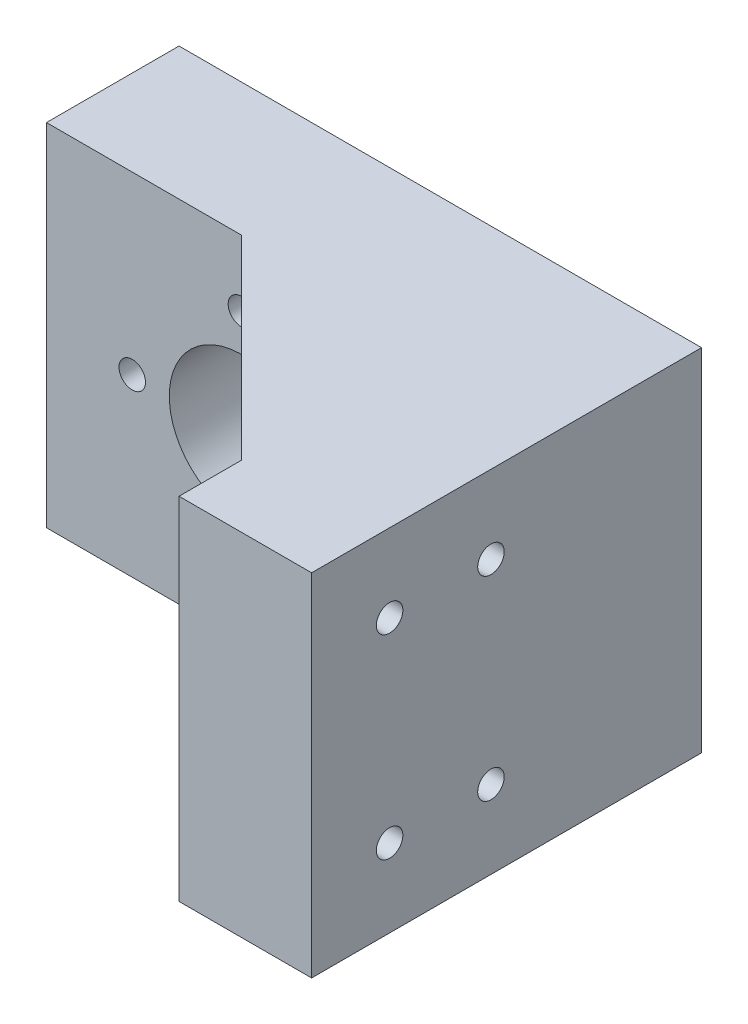
ISO-10303-21;
HEADER;
FILE_DESCRIPTION(('STEP AP214'),'2;1');
FILE_NAME('part.step','',(''),(''),'','','');
FILE_SCHEMA(('AUTOMOTIVE_DESIGN { 1 0 10303 214 1 1 1 1 }'));
ENDSEC;
DATA;
#1=APPLICATION_CONTEXT('core data for automotive mechanical design processes');
#2=APPLICATION_PROTOCOL_DEFINITION('international standard','automotive_design',2000,#1);
#3=PRODUCT_CONTEXT('',#1,'mechanical');
#4=PRODUCT('Part','Part','',(#3));
#5=PRODUCT_RELATED_PRODUCT_CATEGORY('part','',(#4));
#6=PRODUCT_DEFINITION_FORMATION('','',#4);
#7=PRODUCT_DEFINITION_CONTEXT('part definition',#1,'design');
#8=PRODUCT_DEFINITION('design','',#6,#7);
#9=PRODUCT_DEFINITION_SHAPE('','',#8);
#10=(LENGTH_UNIT() NAMED_UNIT(*) SI_UNIT(.MILLI.,.METRE.));
#11=(NAMED_UNIT(*) PLANE_ANGLE_UNIT() SI_UNIT($,.RADIAN.));
#12=(NAMED_UNIT(*) SI_UNIT($,.STERADIAN.) SOLID_ANGLE_UNIT());
#13=UNCERTAINTY_MEASURE_WITH_UNIT(LENGTH_MEASURE(1.E-05),#10,'distance_accuracy_value','');
#14=(GEOMETRIC_REPRESENTATION_CONTEXT(3) GLOBAL_UNCERTAINTY_ASSIGNED_CONTEXT((#13)) GLOBAL_UNIT_ASSIGNED_CONTEXT((#10,
#11,#12)) REPRESENTATION_CONTEXT('',''));
#15=CARTESIAN_POINT('',(0.,0.,0.));
#16=DIRECTION('',(0.,0.,1.));
#17=DIRECTION('',(1.,0.,0.));
#18=AXIS2_PLACEMENT_3D('',#15,#16,#17);
#19=CARTESIAN_POINT('',(16.5,-22.5,50.));
#20=DIRECTION('',(-1.,0.,0.));
#21=DIRECTION('',(0.,0.,1.));
#22=AXIS2_PLACEMENT_3D('',#19,#20,#21);
#23=PLANE('',#22);
#24=CARTESIAN_POINT('',(16.5,12.5,40.));
#25=DIRECTION('',(-1.,0.,0.));
#26=DIRECTION('',(0.,0.,1.));
#27=AXIS2_PLACEMENT_3D('',#24,#25,#26);
#28=CIRCLE('',#27,1.7);
#29=CARTESIAN_POINT('',(16.5,12.5,41.7));
#30=VERTEX_POINT('',#29);
#31=EDGE_CURVE('E162',#30,#30,#28,.T.);
#32=ORIENTED_EDGE('',*,*,#31,.F.);
#33=EDGE_LOOP('',(#32));
#34=FACE_BOUND('',#33,.T.);
#35=CARTESIAN_POINT('',(16.5,-12.5,27.));
#36=DIRECTION('',(-1.,0.,0.));
#37=DIRECTION('',(0.,0.,-1.));
#38=AXIS2_PLACEMENT_3D('',#35,#36,#37);
#39=CIRCLE('',#38,1.7);
#40=CARTESIAN_POINT('',(16.5,-12.5,25.3));
#41=VERTEX_POINT('',#40);
#42=EDGE_CURVE('E169',#41,#41,#39,.T.);
#43=ORIENTED_EDGE('',*,*,#42,.F.);
#44=EDGE_LOOP('',(#43));
#45=FACE_BOUND('',#44,.T.);
#46=CARTESIAN_POINT('',(16.5,12.5,27.));
#47=DIRECTION('',(-1.,0.,0.));
#48=DIRECTION('',(0.,0.,-1.));
#49=AXIS2_PLACEMENT_3D('',#46,#47,#48);
#50=CIRCLE('',#49,1.7);
#51=CARTESIAN_POINT('',(16.5,12.5,25.3));
#52=VERTEX_POINT('',#51);
#53=EDGE_CURVE('E159',#52,#52,#50,.T.);
#54=ORIENTED_EDGE('',*,*,#53,.F.);
#55=EDGE_LOOP('',(#54));
#56=FACE_BOUND('',#55,.T.);
#57=CARTESIAN_POINT('',(16.5,-12.5,40.));
#58=DIRECTION('',(-1.,0.,0.));
#59=DIRECTION('',(0.,0.,1.));
#60=AXIS2_PLACEMENT_3D('',#57,#58,#59);
#61=CIRCLE('',#60,1.7);
#62=CARTESIAN_POINT('',(16.5,-12.5,41.7));
#63=VERTEX_POINT('',#62);
#64=EDGE_CURVE('E164',#63,#63,#61,.T.);
#65=ORIENTED_EDGE('',*,*,#64,.F.);
#66=EDGE_LOOP('',(#65));
#67=FACE_BOUND('',#66,.T.);
#68=DIRECTION('',(0.,1.,0.));
#69=VECTOR('',#68,1.);
#70=CARTESIAN_POINT('',(16.5,-22.5,17.));
#71=LINE('',#70,#69);
#72=CARTESIAN_POINT('',(16.5,-17.5,17.));
#73=VERTEX_POINT('',#72);
#74=CARTESIAN_POINT('',(16.5,17.5,17.));
#75=VERTEX_POINT('',#74);
#76=EDGE_CURVE('E243',#73,#75,#71,.T.);
#77=ORIENTED_EDGE('',*,*,#76,.F.);
#78=DIRECTION('',(0.,0.,1.));
#79=VECTOR('',#78,1.);
#80=CARTESIAN_POINT('',(16.5,-17.5,17.));
#81=LINE('',#80,#79);
#82=CARTESIAN_POINT('',(16.5,-17.5,42.));
#83=VERTEX_POINT('',#82);
#84=EDGE_CURVE('E125',#73,#83,#81,.T.);
#85=ORIENTED_EDGE('',*,*,#84,.T.);
#86=DIRECTION('',(0.,-1.,0.));
#87=VECTOR('',#86,1.);
#88=CARTESIAN_POINT('',(16.5,-17.5,42.));
#89=LINE('',#88,#87);
#90=CARTESIAN_POINT('',(16.5,-22.5,42.));
#91=VERTEX_POINT('',#90);
#92=EDGE_CURVE('E126',#83,#91,#89,.T.);
#93=ORIENTED_EDGE('',*,*,#92,.T.);
#94=DIRECTION('',(0.,0.,1.));
#95=VECTOR('',#94,1.);
#96=CARTESIAN_POINT('',(16.5,-22.5,50.));
#97=LINE('',#96,#95);
#98=CARTESIAN_POINT('',(16.5,-22.5,50.));
#99=VERTEX_POINT('',#98);
#100=EDGE_CURVE('E224',#91,#99,#97,.T.);
#101=ORIENTED_EDGE('',*,*,#100,.T.);
#102=DIRECTION('',(0.,1.,0.));
#103=VECTOR('',#102,1.);
#104=CARTESIAN_POINT('',(16.5,-22.5,50.));
#105=LINE('',#104,#103);
#106=CARTESIAN_POINT('',(16.5,22.5,50.));
#107=VERTEX_POINT('',#106);
#108=EDGE_CURVE('E48',#99,#107,#105,.T.);
#109=ORIENTED_EDGE('',*,*,#108,.T.);
#110=DIRECTION('',(0.,0.,1.));
#111=VECTOR('',#110,1.);
#112=CARTESIAN_POINT('',(16.5,22.5,50.));
#113=LINE('',#112,#111);
#114=CARTESIAN_POINT('',(16.5,22.5,42.));
#115=VERTEX_POINT('',#114);
#116=EDGE_CURVE('E240',#115,#107,#113,.T.);
#117=ORIENTED_EDGE('',*,*,#116,.F.);
#118=DIRECTION('',(0.,1.,0.));
#119=VECTOR('',#118,1.);
#120=CARTESIAN_POINT('',(16.5,17.5,42.));
#121=LINE('',#120,#119);
#122=CARTESIAN_POINT('',(16.5,17.5,42.));
#123=VERTEX_POINT('',#122);
#124=EDGE_CURVE('E155',#123,#115,#121,.T.);
#125=ORIENTED_EDGE('',*,*,#124,.F.);
#126=DIRECTION('',(0.,0.,-1.));
#127=VECTOR('',#126,1.);
#128=CARTESIAN_POINT('',(16.5,17.5,17.));
#129=LINE('',#128,#127);
#130=EDGE_CURVE('E142',#123,#75,#129,.T.);
#131=ORIENTED_EDGE('',*,*,#130,.T.);
#132=EDGE_LOOP('',(#77,#85,#93,#101,#109,#117,#125,#131));
#133=FACE_BOUND('',#132,.T.);
#134=ADVANCED_FACE('F39',(#34,#45,#56,#67,#133),#23,.T.);
#135=CARTESIAN_POINT('',(16.5,-22.5,17.));
#136=DIRECTION('',(0.,0.,1.));
#137=DIRECTION('',(1.,0.,0.));
#138=AXIS2_PLACEMENT_3D('',#135,#136,#137);
#139=PLANE('',#138);
#140=DIRECTION('',(0.,-1.,0.));
#141=VECTOR('',#140,1.);
#142=CARTESIAN_POINT('',(-8.5,-17.5,17.));
#143=LINE('',#142,#141);
#144=CARTESIAN_POINT('',(-8.5,-17.5,17.));
#145=VERTEX_POINT('',#144);
#146=CARTESIAN_POINT('',(-8.5,-22.5,17.));
#147=VERTEX_POINT('',#146);
#148=EDGE_CURVE('E129',#145,#147,#143,.T.);
#149=ORIENTED_EDGE('',*,*,#148,.F.);
#150=DIRECTION('',(1.,0.,0.));
#151=VECTOR('',#150,1.);
#152=CARTESIAN_POINT('',(-8.5,-17.5,17.));
#153=LINE('',#152,#151);
#154=EDGE_CURVE('E120',#145,#73,#153,.T.);
#155=ORIENTED_EDGE('',*,*,#154,.T.);
#156=ORIENTED_EDGE('',*,*,#76,.T.);
#157=DIRECTION('',(-1.,0.,0.));
#158=VECTOR('',#157,1.);
#159=CARTESIAN_POINT('',(-8.5,17.5,17.));
#160=LINE('',#159,#158);
#161=CARTESIAN_POINT('',(-8.5,17.5,17.));
#162=VERTEX_POINT('',#161);
#163=EDGE_CURVE('E144',#75,#162,#160,.T.);
#164=ORIENTED_EDGE('',*,*,#163,.T.);
#165=DIRECTION('',(0.,1.,0.));
#166=VECTOR('',#165,1.);
#167=CARTESIAN_POINT('',(-8.5,17.5,17.));
#168=LINE('',#167,#166);
#169=CARTESIAN_POINT('',(-8.49999999999999,22.5,17.));
#170=VERTEX_POINT('',#169);
#171=EDGE_CURVE('E148',#162,#170,#168,.T.);
#172=ORIENTED_EDGE('',*,*,#171,.T.);
#173=DIRECTION('',(1.,0.,0.));
#174=VECTOR('',#173,1.);
#175=CARTESIAN_POINT('',(16.5,22.5,17.));
#176=LINE('',#175,#174);
#177=CARTESIAN_POINT('',(-33.5,22.5,17.));
#178=VERTEX_POINT('',#177);
#179=EDGE_CURVE('E234',#178,#170,#176,.T.);
#180=ORIENTED_EDGE('',*,*,#179,.F.);
#181=DIRECTION('',(0.,1.,0.));
#182=VECTOR('',#181,1.);
#183=CARTESIAN_POINT('',(-33.5,-22.5,17.));
#184=LINE('',#183,#182);
#185=CARTESIAN_POINT('',(-33.5,-22.5,17.));
#186=VERTEX_POINT('',#185);
#187=EDGE_CURVE('E244',#186,#178,#184,.T.);
#188=ORIENTED_EDGE('',*,*,#187,.F.);
#189=DIRECTION('',(1.,0.,0.));
#190=VECTOR('',#189,1.);
#191=CARTESIAN_POINT('',(16.5,-22.5,17.));
#192=LINE('',#191,#190);
#193=EDGE_CURVE('E135',#186,#147,#192,.T.);
#194=ORIENTED_EDGE('',*,*,#193,.T.);
#195=EDGE_LOOP('',(#149,#155,#156,#164,#172,#180,#188,#194));
#196=FACE_BOUND('',#195,.T.);
#197=CARTESIAN_POINT('',(-8.49999999999999,14.,17.));
#198=DIRECTION('',(0.,0.,1.));
#199=DIRECTION('',(1.,0.,0.));
#200=AXIS2_PLACEMENT_3D('',#197,#198,#199);
#201=CIRCLE('',#200,1.7);
#202=CARTESIAN_POINT('',(-6.79999999999999,14.,17.));
#203=VERTEX_POINT('',#202);
#204=EDGE_CURVE('E195',#203,#203,#201,.T.);
#205=ORIENTED_EDGE('',*,*,#204,.F.);
#206=EDGE_LOOP('',(#205));
#207=FACE_BOUND('',#206,.T.);
#208=CARTESIAN_POINT('',(5.50000000000018,1.42247325030098E-13,17.));
#209=DIRECTION('',(0.,0.,1.));
#210=DIRECTION('',(1.,0.,0.));
#211=AXIS2_PLACEMENT_3D('',#208,#209,#210);
#212=CIRCLE('',#211,1.7);
#213=CARTESIAN_POINT('',(7.20000000000018,1.42247325030098E-13,17.));
#214=VERTEX_POINT('',#213);
#215=EDGE_CURVE('E198',#214,#214,#212,.T.);
#216=ORIENTED_EDGE('',*,*,#215,.F.);
#217=EDGE_LOOP('',(#216));
#218=FACE_BOUND('',#217,.T.);
#219=CARTESIAN_POINT('',(-8.49999999999972,-14.,17.));
#220=DIRECTION('',(0.,0.,1.));
#221=DIRECTION('',(1.,0.,0.));
#222=AXIS2_PLACEMENT_3D('',#219,#220,#221);
#223=CIRCLE('',#222,1.7);
#224=CARTESIAN_POINT('',(-6.79999999999972,-14.,17.));
#225=VERTEX_POINT('',#224);
#226=EDGE_CURVE('E179',#225,#225,#223,.T.);
#227=ORIENTED_EDGE('',*,*,#226,.F.);
#228=EDGE_LOOP('',(#227));
#229=FACE_BOUND('',#228,.T.);
#230=CARTESIAN_POINT('',(-22.4999999999998,0.,17.));
#231=DIRECTION('',(0.,0.,1.));
#232=DIRECTION('',(1.,0.,0.));
#233=AXIS2_PLACEMENT_3D('',#230,#231,#232);
#234=CIRCLE('',#233,1.7);
#235=CARTESIAN_POINT('',(-20.7999999999998,0.,17.));
#236=VERTEX_POINT('',#235);
#237=EDGE_CURVE('E190',#236,#236,#234,.T.);
#238=ORIENTED_EDGE('',*,*,#237,.F.);
#239=EDGE_LOOP('',(#238));
#240=FACE_BOUND('',#239,.T.);
#241=CARTESIAN_POINT('',(-8.5,0.,17.));
#242=DIRECTION('',(0.,0.,1.));
#243=DIRECTION('',(1.,0.,0.));
#244=AXIS2_PLACEMENT_3D('',#241,#242,#243);
#245=CIRCLE('',#244,9.25);
#246=CARTESIAN_POINT('',(0.749999999999995,0.,17.));
#247=VERTEX_POINT('',#246);
#248=EDGE_CURVE('E193',#247,#247,#245,.T.);
#249=ORIENTED_EDGE('',*,*,#248,.F.);
#250=EDGE_LOOP('',(#249));
#251=FACE_BOUND('',#250,.T.);
#252=ADVANCED_FACE('F132',(#196,#207,#218,#229,#240,#251),#139,.T.);
#253=CARTESIAN_POINT('',(33.5,-22.5,0.));
#254=DIRECTION('',(1.,0.,0.));
#255=DIRECTION('',(0.,0.,-1.));
#256=AXIS2_PLACEMENT_3D('',#253,#254,#255);
#257=PLANE('',#256);
#258=CARTESIAN_POINT('',(33.5,12.5,40.));
#259=DIRECTION('',(-1.,0.,0.));
#260=DIRECTION('',(0.,0.,1.));
#261=AXIS2_PLACEMENT_3D('',#258,#259,#260);
#262=CIRCLE('',#261,1.7);
#263=CARTESIAN_POINT('',(33.5,12.5,41.7));
#264=VERTEX_POINT('',#263);
#265=EDGE_CURVE('E168',#264,#264,#262,.T.);
#266=ORIENTED_EDGE('',*,*,#265,.T.);
#267=EDGE_LOOP('',(#266));
#268=FACE_BOUND('',#267,.T.);
#269=CARTESIAN_POINT('',(33.5,-12.5,27.));
#270=DIRECTION('',(-1.,0.,0.));
#271=DIRECTION('',(0.,0.,-1.));
#272=AXIS2_PLACEMENT_3D('',#269,#270,#271);
#273=CIRCLE('',#272,1.7);
#274=CARTESIAN_POINT('',(33.5,-12.5,25.3));
#275=VERTEX_POINT('',#274);
#276=EDGE_CURVE('E158',#275,#275,#273,.T.);
#277=ORIENTED_EDGE('',*,*,#276,.T.);
#278=EDGE_LOOP('',(#277));
#279=FACE_BOUND('',#278,.T.);
#280=CARTESIAN_POINT('',(33.5,12.5,27.));
#281=DIRECTION('',(-1.,0.,0.));
#282=DIRECTION('',(0.,0.,-1.));
#283=AXIS2_PLACEMENT_3D('',#280,#281,#282);
#284=CIRCLE('',#283,1.7);
#285=CARTESIAN_POINT('',(33.5,12.5,25.3));
#286=VERTEX_POINT('',#285);
#287=EDGE_CURVE('E151',#286,#286,#284,.T.);
#288=ORIENTED_EDGE('',*,*,#287,.T.);
#289=EDGE_LOOP('',(#288));
#290=FACE_BOUND('',#289,.T.);
#291=CARTESIAN_POINT('',(33.5,-12.5,40.));
#292=DIRECTION('',(-1.,0.,0.));
#293=DIRECTION('',(0.,0.,1.));
#294=AXIS2_PLACEMENT_3D('',#291,#292,#293);
#295=CIRCLE('',#294,1.7);
#296=CARTESIAN_POINT('',(33.5,-12.5,41.7));
#297=VERTEX_POINT('',#296);
#298=EDGE_CURVE('E172',#297,#297,#295,.T.);
#299=ORIENTED_EDGE('',*,*,#298,.T.);
#300=EDGE_LOOP('',(#299));
#301=FACE_BOUND('',#300,.T.);
#302=DIRECTION('',(0.,0.,-1.));
#303=VECTOR('',#302,1.);
#304=CARTESIAN_POINT('',(33.5,22.5,0.));
#305=LINE('',#304,#303);
#306=CARTESIAN_POINT('',(33.5,22.5,50.));
#307=VERTEX_POINT('',#306);
#308=CARTESIAN_POINT('',(33.5,22.5,0.));
#309=VERTEX_POINT('',#308);
#310=EDGE_CURVE('E210',#307,#309,#305,.T.);
#311=ORIENTED_EDGE('',*,*,#310,.F.);
#312=DIRECTION('',(0.,1.,0.));
#313=VECTOR('',#312,1.);
#314=CARTESIAN_POINT('',(33.5,-22.5,50.));
#315=LINE('',#314,#313);
#316=CARTESIAN_POINT('',(33.5,-22.5,50.));
#317=VERTEX_POINT('',#316);
#318=EDGE_CURVE('E11',#317,#307,#315,.T.);
#319=ORIENTED_EDGE('',*,*,#318,.F.);
#320=DIRECTION('',(0.,0.,-1.));
#321=VECTOR('',#320,1.);
#322=CARTESIAN_POINT('',(33.5,-22.5,0.));
#323=LINE('',#322,#321);
#324=CARTESIAN_POINT('',(33.5,-22.5,0.));
#325=VERTEX_POINT('',#324);
#326=EDGE_CURVE('E208',#317,#325,#323,.T.);
#327=ORIENTED_EDGE('',*,*,#326,.T.);
#328=DIRECTION('',(0.,1.,0.));
#329=VECTOR('',#328,1.);
#330=CARTESIAN_POINT('',(33.5,-22.5,0.));
#331=LINE('',#330,#329);
#332=EDGE_CURVE('E43',#325,#309,#331,.T.);
#333=ORIENTED_EDGE('',*,*,#332,.T.);
#334=EDGE_LOOP('',(#311,#319,#327,#333));
#335=FACE_BOUND('',#334,.T.);
#336=ADVANCED_FACE('F41',(#268,#279,#290,#301,#335),#257,.T.);
#337=CARTESIAN_POINT('',(33.5,-22.5,50.));
#338=DIRECTION('',(0.,0.,1.));
#339=DIRECTION('',(1.,0.,0.));
#340=AXIS2_PLACEMENT_3D('',#337,#338,#339);
#341=PLANE('',#340);
#342=DIRECTION('',(1.,0.,0.));
#343=VECTOR('',#342,1.);
#344=CARTESIAN_POINT('',(33.5,22.5,50.));
#345=LINE('',#344,#343);
#346=EDGE_CURVE('E211',#107,#307,#345,.T.);
#347=ORIENTED_EDGE('',*,*,#346,.F.);
#348=ORIENTED_EDGE('',*,*,#108,.F.);
#349=DIRECTION('',(1.,0.,0.));
#350=VECTOR('',#349,1.);
#351=CARTESIAN_POINT('',(33.5,-22.5,50.));
#352=LINE('',#351,#350);
#353=EDGE_CURVE('E225',#99,#317,#352,.T.);
#354=ORIENTED_EDGE('',*,*,#353,.T.);
#355=ORIENTED_EDGE('',*,*,#318,.T.);
#356=EDGE_LOOP('',(#347,#348,#354,#355));
#357=FACE_BOUND('',#356,.T.);
#358=ADVANCED_FACE('F261',(#357),#341,.T.);
#359=CARTESIAN_POINT('',(-33.5,-22.5,17.));
#360=DIRECTION('',(-1.,0.,0.));
#361=DIRECTION('',(0.,0.,1.));
#362=AXIS2_PLACEMENT_3D('',#359,#360,#361);
#363=PLANE('',#362);
#364=DIRECTION('',(0.,0.,1.));
#365=VECTOR('',#364,1.);
#366=CARTESIAN_POINT('',(-33.5,22.5,17.));
#367=LINE('',#366,#365);
#368=CARTESIAN_POINT('',(-33.5,22.5,0.));
#369=VERTEX_POINT('',#368);
#370=EDGE_CURVE('E233',#369,#178,#367,.T.);
#371=ORIENTED_EDGE('',*,*,#370,.F.);
#372=DIRECTION('',(0.,1.,0.));
#373=VECTOR('',#372,1.);
#374=CARTESIAN_POINT('',(-33.5,-22.5,0.));
#375=LINE('',#374,#373);
#376=CARTESIAN_POINT('',(-33.5,-22.5,0.));
#377=VERTEX_POINT('',#376);
#378=EDGE_CURVE('E246',#377,#369,#375,.T.);
#379=ORIENTED_EDGE('',*,*,#378,.F.);
#380=DIRECTION('',(0.,0.,1.));
#381=VECTOR('',#380,1.);
#382=CARTESIAN_POINT('',(-33.5,-22.5,17.));
#383=LINE('',#382,#381);
#384=EDGE_CURVE('E220',#377,#186,#383,.T.);
#385=ORIENTED_EDGE('',*,*,#384,.T.);
#386=ORIENTED_EDGE('',*,*,#187,.T.);
#387=EDGE_LOOP('',(#371,#379,#385,#386));
#388=FACE_BOUND('',#387,.T.);
#389=ADVANCED_FACE('F266',(#388),#363,.T.);
#390=CARTESIAN_POINT('',(-33.5,-22.5,0.));
#391=DIRECTION('',(0.,0.,-1.));
#392=DIRECTION('',(-1.,0.,0.));
#393=AXIS2_PLACEMENT_3D('',#390,#391,#392);
#394=PLANE('',#393);
#395=CARTESIAN_POINT('',(-8.49999999999999,14.,0.));
#396=DIRECTION('',(0.,0.,1.));
#397=DIRECTION('',(1.,0.,0.));
#398=AXIS2_PLACEMENT_3D('',#395,#396,#397);
#399=CIRCLE('',#398,1.7);
#400=CARTESIAN_POINT('',(-6.79999999999999,14.,0.));
#401=VERTEX_POINT('',#400);
#402=EDGE_CURVE('E196',#401,#401,#399,.T.);
#403=ORIENTED_EDGE('',*,*,#402,.T.);
#404=EDGE_LOOP('',(#403));
#405=FACE_BOUND('',#404,.T.);
#406=CARTESIAN_POINT('',(5.50000000000018,1.42247325030098E-13,0.));
#407=DIRECTION('',(0.,0.,1.));
#408=DIRECTION('',(1.,0.,0.));
#409=AXIS2_PLACEMENT_3D('',#406,#407,#408);
#410=CIRCLE('',#409,1.7);
#411=CARTESIAN_POINT('',(7.20000000000018,1.42247325030098E-13,0.));
#412=VERTEX_POINT('',#411);
#413=EDGE_CURVE('E182',#412,#412,#410,.T.);
#414=ORIENTED_EDGE('',*,*,#413,.T.);
#415=EDGE_LOOP('',(#414));
#416=FACE_BOUND('',#415,.T.);
#417=CARTESIAN_POINT('',(-8.49999999999972,-14.,0.));
#418=DIRECTION('',(0.,0.,1.));
#419=DIRECTION('',(1.,0.,0.));
#420=AXIS2_PLACEMENT_3D('',#417,#418,#419);
#421=CIRCLE('',#420,1.7);
#422=CARTESIAN_POINT('',(-6.79999999999972,-14.,0.));
#423=VERTEX_POINT('',#422);
#424=EDGE_CURVE('E183',#423,#423,#421,.T.);
#425=ORIENTED_EDGE('',*,*,#424,.T.);
#426=EDGE_LOOP('',(#425));
#427=FACE_BOUND('',#426,.T.);
#428=CARTESIAN_POINT('',(-22.4999999999998,0.,0.));
#429=DIRECTION('',(0.,0.,1.));
#430=DIRECTION('',(1.,0.,0.));
#431=AXIS2_PLACEMENT_3D('',#428,#429,#430);
#432=CIRCLE('',#431,1.7);
#433=CARTESIAN_POINT('',(-20.7999999999998,0.,0.));
#434=VERTEX_POINT('',#433);
#435=EDGE_CURVE('E180',#434,#434,#432,.T.);
#436=ORIENTED_EDGE('',*,*,#435,.T.);
#437=EDGE_LOOP('',(#436));
#438=FACE_BOUND('',#437,.T.);
#439=CARTESIAN_POINT('',(-8.5,0.,0.));
#440=DIRECTION('',(0.,0.,1.));
#441=DIRECTION('',(1.,0.,0.));
#442=AXIS2_PLACEMENT_3D('',#439,#440,#441);
#443=CIRCLE('',#442,9.25);
#444=CARTESIAN_POINT('',(0.749999999999995,0.,0.));
#445=VERTEX_POINT('',#444);
#446=EDGE_CURVE('E204',#445,#445,#443,.T.);
#447=ORIENTED_EDGE('',*,*,#446,.T.);
#448=EDGE_LOOP('',(#447));
#449=FACE_BOUND('',#448,.T.);
#450=DIRECTION('',(-1.,0.,0.));
#451=VECTOR('',#450,1.);
#452=CARTESIAN_POINT('',(-33.5,22.5,0.));
#453=LINE('',#452,#451);
#454=EDGE_CURVE('E226',#309,#369,#453,.T.);
#455=ORIENTED_EDGE('',*,*,#454,.F.);
#456=ORIENTED_EDGE('',*,*,#332,.F.);
#457=DIRECTION('',(-1.,0.,0.));
#458=VECTOR('',#457,1.);
#459=CARTESIAN_POINT('',(-33.5,-22.5,0.));
#460=LINE('',#459,#458);
#461=EDGE_CURVE('E214',#325,#377,#460,.T.);
#462=ORIENTED_EDGE('',*,*,#461,.T.);
#463=ORIENTED_EDGE('',*,*,#378,.T.);
#464=EDGE_LOOP('',(#455,#456,#462,#463));
#465=FACE_BOUND('',#464,.T.);
#466=ADVANCED_FACE('F251',(#405,#416,#427,#438,#449,#465),#394,.T.);
#467=CARTESIAN_POINT('',(0.,-22.5,0.));
#468=DIRECTION('',(0.,-1.,0.));
#469=DIRECTION('',(0.,0.,-1.));
#470=AXIS2_PLACEMENT_3D('',#467,#468,#469);
#471=PLANE('',#470);
#472=ORIENTED_EDGE('',*,*,#326,.F.);
#473=ORIENTED_EDGE('',*,*,#353,.F.);
#474=ORIENTED_EDGE('',*,*,#100,.F.);
#475=DIRECTION('',(-0.707106781186547,0.,-0.707106781186547));
#476=VECTOR('',#475,1.);
#477=CARTESIAN_POINT('',(16.5,-22.5,42.));
#478=LINE('',#477,#476);
#479=EDGE_CURVE('E57',#91,#147,#478,.T.);
#480=ORIENTED_EDGE('',*,*,#479,.T.);
#481=ORIENTED_EDGE('',*,*,#193,.F.);
#482=ORIENTED_EDGE('',*,*,#384,.F.);
#483=ORIENTED_EDGE('',*,*,#461,.F.);
#484=EDGE_LOOP('',(#472,#473,#474,#480,#481,#482,#483));
#485=FACE_BOUND('',#484,.T.);
#486=ADVANCED_FACE('F263',(#485),#471,.T.);
#487=CARTESIAN_POINT('',(0.,22.5,0.));
#488=DIRECTION('',(0.,-1.,0.));
#489=DIRECTION('',(0.,0.,-1.));
#490=AXIS2_PLACEMENT_3D('',#487,#488,#489);
#491=PLANE('',#490);
#492=DIRECTION('',(0.707106781186547,0.,0.707106781186547));
#493=VECTOR('',#492,1.);
#494=CARTESIAN_POINT('',(16.5,22.5,42.));
#495=LINE('',#494,#493);
#496=EDGE_CURVE('E61',#170,#115,#495,.T.);
#497=ORIENTED_EDGE('',*,*,#496,.T.);
#498=ORIENTED_EDGE('',*,*,#116,.T.);
#499=ORIENTED_EDGE('',*,*,#346,.T.);
#500=ORIENTED_EDGE('',*,*,#310,.T.);
#501=ORIENTED_EDGE('',*,*,#454,.T.);
#502=ORIENTED_EDGE('',*,*,#370,.T.);
#503=ORIENTED_EDGE('',*,*,#179,.T.);
#504=EDGE_LOOP('',(#497,#498,#499,#500,#501,#502,#503));
#505=FACE_BOUND('',#504,.T.);
#506=ADVANCED_FACE('F257',(#505),#491,.F.);
#507=CARTESIAN_POINT('',(-8.5,0.,0.));
#508=DIRECTION('',(0.,0.,1.));
#509=DIRECTION('',(1.,0.,0.));
#510=AXIS2_PLACEMENT_3D('',#507,#508,#509);
#511=CYLINDRICAL_SURFACE('',#510,9.25);
#512=ORIENTED_EDGE('',*,*,#446,.F.);
#513=EDGE_LOOP('',(#512));
#514=FACE_BOUND('',#513,.T.);
#515=ORIENTED_EDGE('',*,*,#248,.T.);
#516=EDGE_LOOP('',(#515));
#517=FACE_BOUND('',#516,.T.);
#518=ADVANCED_FACE('F308',(#514,#517),#511,.F.);
#519=CARTESIAN_POINT('',(-22.4999999999998,0.,0.));
#520=DIRECTION('',(0.,0.,1.));
#521=DIRECTION('',(1.,0.,0.));
#522=AXIS2_PLACEMENT_3D('',#519,#520,#521);
#523=CYLINDRICAL_SURFACE('',#522,1.7);
#524=ORIENTED_EDGE('',*,*,#435,.F.);
#525=EDGE_LOOP('',(#524));
#526=FACE_BOUND('',#525,.T.);
#527=ORIENTED_EDGE('',*,*,#237,.T.);
#528=EDGE_LOOP('',(#527));
#529=FACE_BOUND('',#528,.T.);
#530=ADVANCED_FACE('F309',(#526,#529),#523,.F.);
#531=CARTESIAN_POINT('',(-8.49999999999972,-14.,0.));
#532=DIRECTION('',(0.,0.,1.));
#533=DIRECTION('',(1.,0.,0.));
#534=AXIS2_PLACEMENT_3D('',#531,#532,#533);
#535=CYLINDRICAL_SURFACE('',#534,1.7);
#536=ORIENTED_EDGE('',*,*,#424,.F.);
#537=EDGE_LOOP('',(#536));
#538=FACE_BOUND('',#537,.T.);
#539=ORIENTED_EDGE('',*,*,#226,.T.);
#540=EDGE_LOOP('',(#539));
#541=FACE_BOUND('',#540,.T.);
#542=ADVANCED_FACE('F320',(#538,#541),#535,.F.);
#543=CARTESIAN_POINT('',(5.50000000000018,1.42247325030098E-13,0.));
#544=DIRECTION('',(0.,0.,1.));
#545=DIRECTION('',(1.,0.,0.));
#546=AXIS2_PLACEMENT_3D('',#543,#544,#545);
#547=CYLINDRICAL_SURFACE('',#546,1.7);
#548=ORIENTED_EDGE('',*,*,#413,.F.);
#549=EDGE_LOOP('',(#548));
#550=FACE_BOUND('',#549,.T.);
#551=ORIENTED_EDGE('',*,*,#215,.T.);
#552=EDGE_LOOP('',(#551));
#553=FACE_BOUND('',#552,.T.);
#554=ADVANCED_FACE('F325',(#550,#553),#547,.F.);
#555=CARTESIAN_POINT('',(-8.49999999999999,14.,0.));
#556=DIRECTION('',(0.,0.,1.));
#557=DIRECTION('',(1.,0.,0.));
#558=AXIS2_PLACEMENT_3D('',#555,#556,#557);
#559=CYLINDRICAL_SURFACE('',#558,1.7);
#560=ORIENTED_EDGE('',*,*,#402,.F.);
#561=EDGE_LOOP('',(#560));
#562=FACE_BOUND('',#561,.T.);
#563=ORIENTED_EDGE('',*,*,#204,.T.);
#564=EDGE_LOOP('',(#563));
#565=FACE_BOUND('',#564,.T.);
#566=ADVANCED_FACE('F323',(#562,#565),#559,.F.);
#567=CARTESIAN_POINT('',(33.5,-12.5,40.));
#568=DIRECTION('',(-1.,0.,0.));
#569=DIRECTION('',(0.,0.,1.));
#570=AXIS2_PLACEMENT_3D('',#567,#568,#569);
#571=CYLINDRICAL_SURFACE('',#570,1.7);
#572=ORIENTED_EDGE('',*,*,#298,.F.);
#573=EDGE_LOOP('',(#572));
#574=FACE_BOUND('',#573,.T.);
#575=ORIENTED_EDGE('',*,*,#64,.T.);
#576=EDGE_LOOP('',(#575));
#577=FACE_BOUND('',#576,.T.);
#578=ADVANCED_FACE('F329',(#574,#577),#571,.F.);
#579=CARTESIAN_POINT('',(33.5,12.5,27.));
#580=DIRECTION('',(-1.,0.,0.));
#581=DIRECTION('',(0.,0.,1.));
#582=AXIS2_PLACEMENT_3D('',#579,#580,#581);
#583=CYLINDRICAL_SURFACE('',#582,1.7);
#584=ORIENTED_EDGE('',*,*,#287,.F.);
#585=EDGE_LOOP('',(#584));
#586=FACE_BOUND('',#585,.T.);
#587=ORIENTED_EDGE('',*,*,#53,.T.);
#588=EDGE_LOOP('',(#587));
#589=FACE_BOUND('',#588,.T.);
#590=ADVANCED_FACE('F337',(#586,#589),#583,.F.);
#591=CARTESIAN_POINT('',(33.5,-12.5,27.));
#592=DIRECTION('',(-1.,0.,0.));
#593=DIRECTION('',(0.,0.,1.));
#594=AXIS2_PLACEMENT_3D('',#591,#592,#593);
#595=CYLINDRICAL_SURFACE('',#594,1.7);
#596=ORIENTED_EDGE('',*,*,#276,.F.);
#597=EDGE_LOOP('',(#596));
#598=FACE_BOUND('',#597,.T.);
#599=ORIENTED_EDGE('',*,*,#42,.T.);
#600=EDGE_LOOP('',(#599));
#601=FACE_BOUND('',#600,.T.);
#602=ADVANCED_FACE('F336',(#598,#601),#595,.F.);
#603=CARTESIAN_POINT('',(33.5,12.5,40.));
#604=DIRECTION('',(-1.,0.,0.));
#605=DIRECTION('',(0.,0.,1.));
#606=AXIS2_PLACEMENT_3D('',#603,#604,#605);
#607=CYLINDRICAL_SURFACE('',#606,1.7);
#608=ORIENTED_EDGE('',*,*,#265,.F.);
#609=EDGE_LOOP('',(#608));
#610=FACE_BOUND('',#609,.T.);
#611=ORIENTED_EDGE('',*,*,#31,.T.);
#612=EDGE_LOOP('',(#611));
#613=FACE_BOUND('',#612,.T.);
#614=ADVANCED_FACE('F342',(#610,#613),#607,.F.);
#615=CARTESIAN_POINT('',(16.5,17.5,42.));
#616=DIRECTION('',(-0.707106781186548,0.,0.707106781186548));
#617=DIRECTION('',(0.707106781186548,0.,0.707106781186548));
#618=AXIS2_PLACEMENT_3D('',#615,#616,#617);
#619=PLANE('',#618);
#620=ORIENTED_EDGE('',*,*,#496,.F.);
#621=ORIENTED_EDGE('',*,*,#171,.F.);
#622=DIRECTION('',(0.707106781186547,0.,0.707106781186547));
#623=VECTOR('',#622,1.);
#624=CARTESIAN_POINT('',(16.5,17.5,42.));
#625=LINE('',#624,#623);
#626=EDGE_CURVE('E150',#162,#123,#625,.T.);
#627=ORIENTED_EDGE('',*,*,#626,.T.);
#628=ORIENTED_EDGE('',*,*,#124,.T.);
#629=EDGE_LOOP('',(#620,#621,#627,#628));
#630=FACE_BOUND('',#629,.T.);
#631=ADVANCED_FACE('F275',(#630),#619,.T.);
#632=CARTESIAN_POINT('',(0.,17.5,0.));
#633=DIRECTION('',(0.,1.,0.));
#634=DIRECTION('',(0.,0.,1.));
#635=AXIS2_PLACEMENT_3D('',#632,#633,#634);
#636=PLANE('',#635);
#637=ORIENTED_EDGE('',*,*,#130,.F.);
#638=ORIENTED_EDGE('',*,*,#626,.F.);
#639=ORIENTED_EDGE('',*,*,#163,.F.);
#640=EDGE_LOOP('',(#637,#638,#639));
#641=FACE_BOUND('',#640,.T.);
#642=ADVANCED_FACE('F273',(#641),#636,.F.);
#643=CARTESIAN_POINT('',(16.5,-17.5,42.));
#644=DIRECTION('',(-0.707106781186548,0.,0.707106781186548));
#645=DIRECTION('',(0.707106781186548,0.,0.707106781186548));
#646=AXIS2_PLACEMENT_3D('',#643,#644,#645);
#647=PLANE('',#646);
#648=ORIENTED_EDGE('',*,*,#479,.F.);
#649=ORIENTED_EDGE('',*,*,#92,.F.);
#650=DIRECTION('',(-0.707106781186547,0.,-0.707106781186547));
#651=VECTOR('',#650,1.);
#652=CARTESIAN_POINT('',(16.5,-17.5,42.));
#653=LINE('',#652,#651);
#654=EDGE_CURVE('E119',#83,#145,#653,.T.);
#655=ORIENTED_EDGE('',*,*,#654,.T.);
#656=ORIENTED_EDGE('',*,*,#148,.T.);
#657=EDGE_LOOP('',(#648,#649,#655,#656));
#658=FACE_BOUND('',#657,.T.);
#659=ADVANCED_FACE('F130',(#658),#647,.T.);
#660=CARTESIAN_POINT('',(0.,-17.5,0.));
#661=DIRECTION('',(0.,-1.,0.));
#662=DIRECTION('',(0.,0.,-1.));
#663=AXIS2_PLACEMENT_3D('',#660,#661,#662);
#664=PLANE('',#663);
#665=ORIENTED_EDGE('',*,*,#654,.F.);
#666=ORIENTED_EDGE('',*,*,#84,.F.);
#667=ORIENTED_EDGE('',*,*,#154,.F.);
#668=EDGE_LOOP('',(#665,#666,#667));
#669=FACE_BOUND('',#668,.T.);
#670=ADVANCED_FACE('F118',(#669),#664,.F.);
#671=CLOSED_SHELL('',(#134,#252,#336,#358,#389,#466,#486,#506,#518,#530,#542,#554,#566,#578,
#590,#602,#614,#631,#642,#659,#670));
#672=MANIFOLD_SOLID_BREP('B2',#671);
#673=ADVANCED_BREP_SHAPE_REPRESENTATION('',(#18,#672),#14);
#674=SHAPE_DEFINITION_REPRESENTATION(#9,#673);
ENDSEC;
END-ISO-10303-21;
